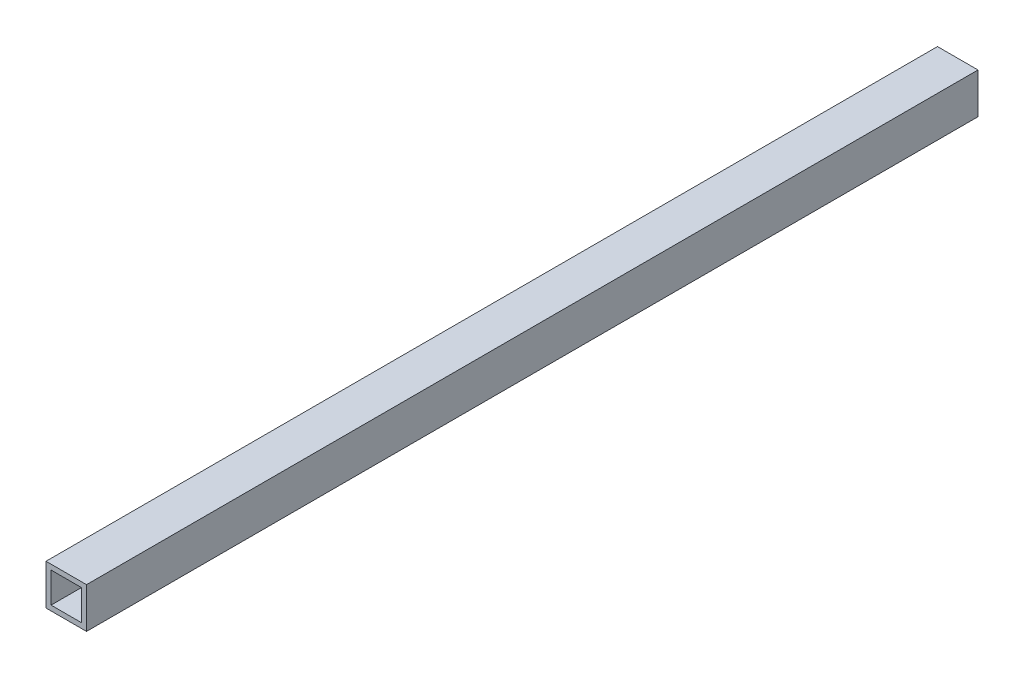
ISO-10303-21;
HEADER;
FILE_DESCRIPTION(('STEP AP214'),'2;1');
FILE_NAME('part.step','',(''),(''),'','','');
FILE_SCHEMA(('AUTOMOTIVE_DESIGN { 1 0 10303 214 1 1 1 1 }'));
ENDSEC;
DATA;
#1=APPLICATION_CONTEXT('core data for automotive mechanical design processes');
#2=APPLICATION_PROTOCOL_DEFINITION('international standard','automotive_design',2000,#1);
#3=PRODUCT_CONTEXT('',#1,'mechanical');
#4=PRODUCT('Part','Part','',(#3));
#5=PRODUCT_RELATED_PRODUCT_CATEGORY('part','',(#4));
#6=PRODUCT_DEFINITION_FORMATION('','',#4);
#7=PRODUCT_DEFINITION_CONTEXT('part definition',#1,'design');
#8=PRODUCT_DEFINITION('design','',#6,#7);
#9=PRODUCT_DEFINITION_SHAPE('','',#8);
#10=(LENGTH_UNIT() NAMED_UNIT(*) SI_UNIT(.MILLI.,.METRE.));
#11=(NAMED_UNIT(*) PLANE_ANGLE_UNIT() SI_UNIT($,.RADIAN.));
#12=(NAMED_UNIT(*) SI_UNIT($,.STERADIAN.) SOLID_ANGLE_UNIT());
#13=UNCERTAINTY_MEASURE_WITH_UNIT(LENGTH_MEASURE(1.E-05),#10,'distance_accuracy_value','');
#14=(GEOMETRIC_REPRESENTATION_CONTEXT(3) GLOBAL_UNCERTAINTY_ASSIGNED_CONTEXT((#13)) GLOBAL_UNIT_ASSIGNED_CONTEXT((#10,
#11,#12)) REPRESENTATION_CONTEXT('',''));
#15=CARTESIAN_POINT('',(0.,0.,0.));
#16=DIRECTION('',(0.,0.,1.));
#17=DIRECTION('',(1.,0.,0.));
#18=AXIS2_PLACEMENT_3D('',#15,#16,#17);
#19=CARTESIAN_POINT('',(0.,0.,558.8));
#20=DIRECTION('',(0.,0.,-1.));
#21=DIRECTION('',(-1.,0.,0.));
#22=AXIS2_PLACEMENT_3D('',#19,#20,#21);
#23=PLANE('',#22);
#24=DIRECTION('',(0.,-1.,0.));
#25=VECTOR('',#24,1.);
#26=CARTESIAN_POINT('',(-12.7,12.7,558.8));
#27=LINE('',#26,#25);
#28=CARTESIAN_POINT('',(-12.7,12.7,558.8));
#29=VERTEX_POINT('',#28);
#30=CARTESIAN_POINT('',(-12.7,-12.7,558.8));
#31=VERTEX_POINT('',#30);
#32=EDGE_CURVE('E153',#29,#31,#27,.T.);
#33=ORIENTED_EDGE('',*,*,#32,.T.);
#34=DIRECTION('',(1.,0.,0.));
#35=VECTOR('',#34,1.);
#36=CARTESIAN_POINT('',(12.7,-12.7,558.8));
#37=LINE('',#36,#35);
#38=CARTESIAN_POINT('',(12.7,-12.7,558.8));
#39=VERTEX_POINT('',#38);
#40=EDGE_CURVE('E157',#31,#39,#37,.T.);
#41=ORIENTED_EDGE('',*,*,#40,.T.);
#42=DIRECTION('',(0.,1.,0.));
#43=VECTOR('',#42,1.);
#44=CARTESIAN_POINT('',(12.7,12.7,558.8));
#45=LINE('',#44,#43);
#46=CARTESIAN_POINT('',(12.7,12.7,558.8));
#47=VERTEX_POINT('',#46);
#48=EDGE_CURVE('E161',#39,#47,#45,.T.);
#49=ORIENTED_EDGE('',*,*,#48,.T.);
#50=DIRECTION('',(-1.,0.,0.));
#51=VECTOR('',#50,1.);
#52=CARTESIAN_POINT('',(12.7,12.7,558.8));
#53=LINE('',#52,#51);
#54=EDGE_CURVE('E164',#47,#29,#53,.T.);
#55=ORIENTED_EDGE('',*,*,#54,.T.);
#56=EDGE_LOOP('',(#33,#41,#49,#55));
#57=FACE_BOUND('',#56,.T.);
#58=DIRECTION('',(0.,-1.,0.));
#59=VECTOR('',#58,1.);
#60=CARTESIAN_POINT('',(-9.52500000000001,9.52499999999999,558.8));
#61=LINE('',#60,#59);
#62=CARTESIAN_POINT('',(-9.52500000000001,9.52499999999999,558.8));
#63=VERTEX_POINT('',#62);
#64=CARTESIAN_POINT('',(-9.52500000000001,-9.52500000000001,558.8));
#65=VERTEX_POINT('',#64);
#66=EDGE_CURVE('E105',#63,#65,#61,.T.);
#67=ORIENTED_EDGE('',*,*,#66,.F.);
#68=DIRECTION('',(-1.,0.,0.));
#69=VECTOR('',#68,1.);
#70=CARTESIAN_POINT('',(9.52499999999999,9.52499999999999,558.8));
#71=LINE('',#70,#69);
#72=CARTESIAN_POINT('',(9.52499999999999,9.52499999999999,558.8));
#73=VERTEX_POINT('',#72);
#74=EDGE_CURVE('E131',#73,#63,#71,.T.);
#75=ORIENTED_EDGE('',*,*,#74,.F.);
#76=DIRECTION('',(0.,1.,0.));
#77=VECTOR('',#76,1.);
#78=CARTESIAN_POINT('',(9.52499999999999,9.52499999999999,558.8));
#79=LINE('',#78,#77);
#80=CARTESIAN_POINT('',(9.52499999999999,-9.52500000000001,558.8));
#81=VERTEX_POINT('',#80);
#82=EDGE_CURVE('E127',#81,#73,#79,.T.);
#83=ORIENTED_EDGE('',*,*,#82,.F.);
#84=DIRECTION('',(1.,0.,0.));
#85=VECTOR('',#84,1.);
#86=CARTESIAN_POINT('',(9.52499999999999,-9.52500000000001,558.8));
#87=LINE('',#86,#85);
#88=EDGE_CURVE('E114',#65,#81,#87,.T.);
#89=ORIENTED_EDGE('',*,*,#88,.F.);
#90=EDGE_LOOP('',(#67,#75,#83,#89));
#91=FACE_BOUND('',#90,.T.);
#92=ADVANCED_FACE('F39',(#57,#91),#23,.F.);
#93=CARTESIAN_POINT('',(0.,0.,0.));
#94=DIRECTION('',(0.,0.,-1.));
#95=DIRECTION('',(-1.,0.,0.));
#96=AXIS2_PLACEMENT_3D('',#93,#94,#95);
#97=PLANE('',#96);
#98=DIRECTION('',(0.,-1.,0.));
#99=VECTOR('',#98,1.);
#100=CARTESIAN_POINT('',(-12.7,12.7,0.));
#101=LINE('',#100,#99);
#102=CARTESIAN_POINT('',(-12.7,12.7,0.));
#103=VERTEX_POINT('',#102);
#104=CARTESIAN_POINT('',(-12.7,-12.7,0.));
#105=VERTEX_POINT('',#104);
#106=EDGE_CURVE('E123',#103,#105,#101,.T.);
#107=ORIENTED_EDGE('',*,*,#106,.F.);
#108=DIRECTION('',(-1.,0.,0.));
#109=VECTOR('',#108,1.);
#110=CARTESIAN_POINT('',(12.7,12.7,0.));
#111=LINE('',#110,#109);
#112=CARTESIAN_POINT('',(12.7,12.7,0.));
#113=VERTEX_POINT('',#112);
#114=EDGE_CURVE('E158',#113,#103,#111,.T.);
#115=ORIENTED_EDGE('',*,*,#114,.F.);
#116=DIRECTION('',(0.,1.,0.));
#117=VECTOR('',#116,1.);
#118=CARTESIAN_POINT('',(12.7,12.7,0.));
#119=LINE('',#118,#117);
#120=CARTESIAN_POINT('',(12.7,-12.7,0.));
#121=VERTEX_POINT('',#120);
#122=EDGE_CURVE('E174',#121,#113,#119,.T.);
#123=ORIENTED_EDGE('',*,*,#122,.F.);
#124=DIRECTION('',(1.,0.,0.));
#125=VECTOR('',#124,1.);
#126=CARTESIAN_POINT('',(12.7,-12.7,0.));
#127=LINE('',#126,#125);
#128=EDGE_CURVE('E171',#105,#121,#127,.T.);
#129=ORIENTED_EDGE('',*,*,#128,.F.);
#130=EDGE_LOOP('',(#107,#115,#123,#129));
#131=FACE_BOUND('',#130,.T.);
#132=DIRECTION('',(-1.,0.,0.));
#133=VECTOR('',#132,1.);
#134=CARTESIAN_POINT('',(9.52499999999999,9.52499999999999,0.));
#135=LINE('',#134,#133);
#136=CARTESIAN_POINT('',(9.52499999999999,9.52499999999999,0.));
#137=VERTEX_POINT('',#136);
#138=CARTESIAN_POINT('',(-9.52500000000001,9.52499999999999,0.));
#139=VERTEX_POINT('',#138);
#140=EDGE_CURVE('E115',#137,#139,#135,.T.);
#141=ORIENTED_EDGE('',*,*,#140,.T.);
#142=DIRECTION('',(0.,-1.,0.));
#143=VECTOR('',#142,1.);
#144=CARTESIAN_POINT('',(-9.52500000000001,9.52499999999999,0.));
#145=LINE('',#144,#143);
#146=CARTESIAN_POINT('',(-9.52500000000001,-9.52500000000001,0.));
#147=VERTEX_POINT('',#146);
#148=EDGE_CURVE('E63',#139,#147,#145,.T.);
#149=ORIENTED_EDGE('',*,*,#148,.T.);
#150=DIRECTION('',(1.,0.,0.));
#151=VECTOR('',#150,1.);
#152=CARTESIAN_POINT('',(9.52499999999999,-9.52500000000001,0.));
#153=LINE('',#152,#151);
#154=CARTESIAN_POINT('',(9.52499999999999,-9.52500000000001,0.));
#155=VERTEX_POINT('',#154);
#156=EDGE_CURVE('E121',#147,#155,#153,.T.);
#157=ORIENTED_EDGE('',*,*,#156,.T.);
#158=DIRECTION('',(0.,1.,0.));
#159=VECTOR('',#158,1.);
#160=CARTESIAN_POINT('',(9.52499999999999,9.52499999999999,0.));
#161=LINE('',#160,#159);
#162=EDGE_CURVE('E140',#155,#137,#161,.T.);
#163=ORIENTED_EDGE('',*,*,#162,.T.);
#164=EDGE_LOOP('',(#141,#149,#157,#163));
#165=FACE_BOUND('',#164,.T.);
#166=ADVANCED_FACE('F197',(#131,#165),#97,.T.);
#167=CARTESIAN_POINT('',(-12.7,12.7,558.8));
#168=DIRECTION('',(1.,0.,0.));
#169=DIRECTION('',(0.,0.,-1.));
#170=AXIS2_PLACEMENT_3D('',#167,#168,#169);
#171=PLANE('',#170);
#172=ORIENTED_EDGE('',*,*,#106,.T.);
#173=DIRECTION('',(0.,0.,-1.));
#174=VECTOR('',#173,1.);
#175=CARTESIAN_POINT('',(-12.7,-12.7,558.8));
#176=LINE('',#175,#174);
#177=EDGE_CURVE('E11',#31,#105,#176,.T.);
#178=ORIENTED_EDGE('',*,*,#177,.F.);
#179=ORIENTED_EDGE('',*,*,#32,.F.);
#180=DIRECTION('',(0.,0.,-1.));
#181=VECTOR('',#180,1.);
#182=CARTESIAN_POINT('',(-12.7,12.7,558.8));
#183=LINE('',#182,#181);
#184=EDGE_CURVE('E167',#29,#103,#183,.T.);
#185=ORIENTED_EDGE('',*,*,#184,.T.);
#186=EDGE_LOOP('',(#172,#178,#179,#185));
#187=FACE_BOUND('',#186,.T.);
#188=ADVANCED_FACE('F41',(#187),#171,.F.);
#189=CARTESIAN_POINT('',(12.7,-12.7,558.8));
#190=DIRECTION('',(0.,1.,0.));
#191=DIRECTION('',(0.,0.,1.));
#192=AXIS2_PLACEMENT_3D('',#189,#190,#191);
#193=PLANE('',#192);
#194=ORIENTED_EDGE('',*,*,#128,.T.);
#195=DIRECTION('',(0.,0.,-1.));
#196=VECTOR('',#195,1.);
#197=CARTESIAN_POINT('',(12.7,-12.7,558.8));
#198=LINE('',#197,#196);
#199=EDGE_CURVE('E48',#39,#121,#198,.T.);
#200=ORIENTED_EDGE('',*,*,#199,.F.);
#201=ORIENTED_EDGE('',*,*,#40,.F.);
#202=ORIENTED_EDGE('',*,*,#177,.T.);
#203=EDGE_LOOP('',(#194,#200,#201,#202));
#204=FACE_BOUND('',#203,.T.);
#205=ADVANCED_FACE('F207',(#204),#193,.F.);
#206=CARTESIAN_POINT('',(12.7,12.7,558.8));
#207=DIRECTION('',(-1.,0.,0.));
#208=DIRECTION('',(0.,0.,1.));
#209=AXIS2_PLACEMENT_3D('',#206,#207,#208);
#210=PLANE('',#209);
#211=ORIENTED_EDGE('',*,*,#122,.T.);
#212=DIRECTION('',(0.,0.,-1.));
#213=VECTOR('',#212,1.);
#214=CARTESIAN_POINT('',(12.7,12.7,558.8));
#215=LINE('',#214,#213);
#216=EDGE_CURVE('E182',#47,#113,#215,.T.);
#217=ORIENTED_EDGE('',*,*,#216,.F.);
#218=ORIENTED_EDGE('',*,*,#48,.F.);
#219=ORIENTED_EDGE('',*,*,#199,.T.);
#220=EDGE_LOOP('',(#211,#217,#218,#219));
#221=FACE_BOUND('',#220,.T.);
#222=ADVANCED_FACE('F191',(#221),#210,.F.);
#223=CARTESIAN_POINT('',(12.7,12.7,558.8));
#224=DIRECTION('',(0.,-1.,0.));
#225=DIRECTION('',(0.,0.,-1.));
#226=AXIS2_PLACEMENT_3D('',#223,#224,#225);
#227=PLANE('',#226);
#228=ORIENTED_EDGE('',*,*,#114,.T.);
#229=ORIENTED_EDGE('',*,*,#184,.F.);
#230=ORIENTED_EDGE('',*,*,#54,.F.);
#231=ORIENTED_EDGE('',*,*,#216,.T.);
#232=EDGE_LOOP('',(#228,#229,#230,#231));
#233=FACE_BOUND('',#232,.T.);
#234=ADVANCED_FACE('F201',(#233),#227,.F.);
#235=CARTESIAN_POINT('',(-9.52500000000001,9.52499999999999,558.8));
#236=DIRECTION('',(1.,0.,0.));
#237=DIRECTION('',(0.,0.,-1.));
#238=AXIS2_PLACEMENT_3D('',#235,#236,#237);
#239=PLANE('',#238);
#240=ORIENTED_EDGE('',*,*,#148,.F.);
#241=DIRECTION('',(0.,0.,-1.));
#242=VECTOR('',#241,1.);
#243=CARTESIAN_POINT('',(-9.52500000000001,9.52499999999999,558.8));
#244=LINE('',#243,#242);
#245=EDGE_CURVE('E109',#63,#139,#244,.T.);
#246=ORIENTED_EDGE('',*,*,#245,.F.);
#247=ORIENTED_EDGE('',*,*,#66,.T.);
#248=DIRECTION('',(0.,0.,-1.));
#249=VECTOR('',#248,1.);
#250=CARTESIAN_POINT('',(-9.52500000000001,-9.52500000000001,558.8));
#251=LINE('',#250,#249);
#252=EDGE_CURVE('E108',#65,#147,#251,.T.);
#253=ORIENTED_EDGE('',*,*,#252,.T.);
#254=EDGE_LOOP('',(#240,#246,#247,#253));
#255=FACE_BOUND('',#254,.T.);
#256=ADVANCED_FACE('F107',(#255),#239,.T.);
#257=CARTESIAN_POINT('',(9.52499999999999,-9.52500000000001,558.8));
#258=DIRECTION('',(0.,1.,0.));
#259=DIRECTION('',(0.,0.,1.));
#260=AXIS2_PLACEMENT_3D('',#257,#258,#259);
#261=PLANE('',#260);
#262=ORIENTED_EDGE('',*,*,#156,.F.);
#263=ORIENTED_EDGE('',*,*,#252,.F.);
#264=ORIENTED_EDGE('',*,*,#88,.T.);
#265=DIRECTION('',(0.,0.,-1.));
#266=VECTOR('',#265,1.);
#267=CARTESIAN_POINT('',(9.52499999999999,-9.52500000000001,558.8));
#268=LINE('',#267,#266);
#269=EDGE_CURVE('E124',#81,#155,#268,.T.);
#270=ORIENTED_EDGE('',*,*,#269,.T.);
#271=EDGE_LOOP('',(#262,#263,#264,#270));
#272=FACE_BOUND('',#271,.T.);
#273=ADVANCED_FACE('F118',(#272),#261,.T.);
#274=CARTESIAN_POINT('',(9.52499999999999,9.52499999999999,558.8));
#275=DIRECTION('',(-1.,0.,0.));
#276=DIRECTION('',(0.,0.,1.));
#277=AXIS2_PLACEMENT_3D('',#274,#275,#276);
#278=PLANE('',#277);
#279=ORIENTED_EDGE('',*,*,#162,.F.);
#280=ORIENTED_EDGE('',*,*,#269,.F.);
#281=ORIENTED_EDGE('',*,*,#82,.T.);
#282=DIRECTION('',(0.,0.,-1.));
#283=VECTOR('',#282,1.);
#284=CARTESIAN_POINT('',(9.52499999999999,9.52499999999999,558.8));
#285=LINE('',#284,#283);
#286=EDGE_CURVE('E55',#73,#137,#285,.T.);
#287=ORIENTED_EDGE('',*,*,#286,.T.);
#288=EDGE_LOOP('',(#279,#280,#281,#287));
#289=FACE_BOUND('',#288,.T.);
#290=ADVANCED_FACE('F230',(#289),#278,.T.);
#291=CARTESIAN_POINT('',(9.52499999999999,9.52499999999999,558.8));
#292=DIRECTION('',(0.,-1.,0.));
#293=DIRECTION('',(0.,0.,-1.));
#294=AXIS2_PLACEMENT_3D('',#291,#292,#293);
#295=PLANE('',#294);
#296=ORIENTED_EDGE('',*,*,#140,.F.);
#297=ORIENTED_EDGE('',*,*,#286,.F.);
#298=ORIENTED_EDGE('',*,*,#74,.T.);
#299=ORIENTED_EDGE('',*,*,#245,.T.);
#300=EDGE_LOOP('',(#296,#297,#298,#299));
#301=FACE_BOUND('',#300,.T.);
#302=ADVANCED_FACE('F234',(#301),#295,.T.);
#303=CLOSED_SHELL('',(#92,#166,#188,#205,#222,#234,#256,#273,#290,#302));
#304=MANIFOLD_SOLID_BREP('B2',#303);
#305=ADVANCED_BREP_SHAPE_REPRESENTATION('',(#18,#304),#14);
#306=SHAPE_DEFINITION_REPRESENTATION(#9,#305);
ENDSEC;
END-ISO-10303-21;
